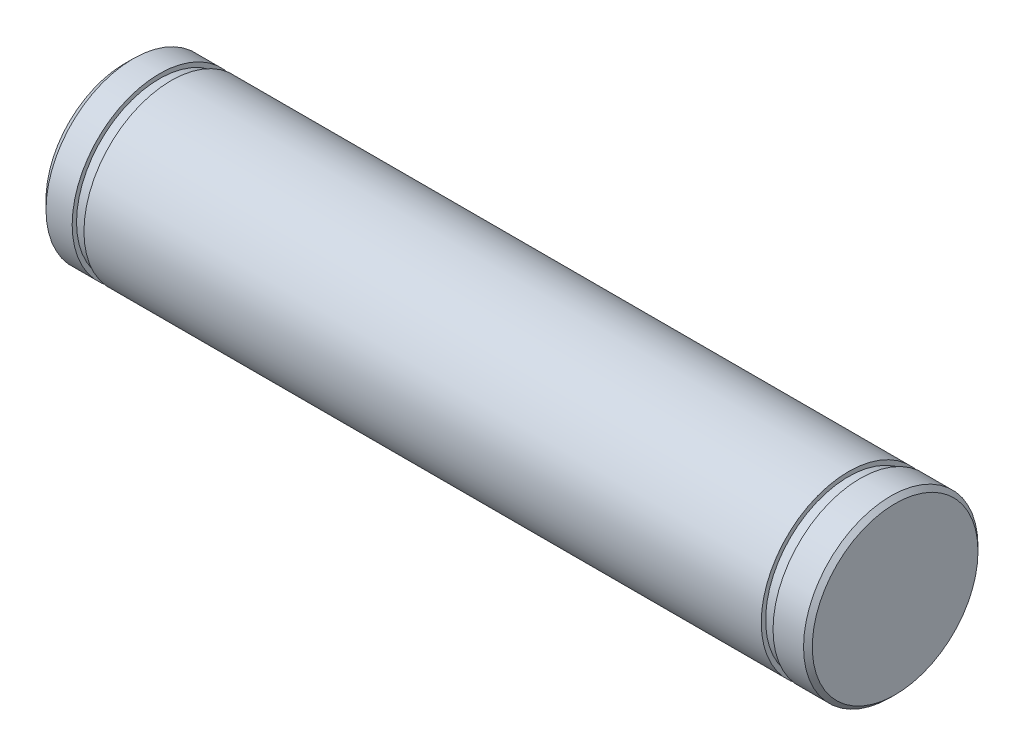
ISO-10303-21;
HEADER;
FILE_DESCRIPTION(('STEP AP214'),'2;1');
FILE_NAME('part.step','',(''),(''),'','','');
FILE_SCHEMA(('AUTOMOTIVE_DESIGN { 1 0 10303 214 1 1 1 1 }'));
ENDSEC;
DATA;
#1=APPLICATION_CONTEXT('core data for automotive mechanical design processes');
#2=APPLICATION_PROTOCOL_DEFINITION('international standard','automotive_design',2000,#1);
#3=PRODUCT_CONTEXT('',#1,'mechanical');
#4=PRODUCT('Part','Part','',(#3));
#5=PRODUCT_RELATED_PRODUCT_CATEGORY('part','',(#4));
#6=PRODUCT_DEFINITION_FORMATION('','',#4);
#7=PRODUCT_DEFINITION_CONTEXT('part definition',#1,'design');
#8=PRODUCT_DEFINITION('design','',#6,#7);
#9=PRODUCT_DEFINITION_SHAPE('','',#8);
#10=(LENGTH_UNIT() NAMED_UNIT(*) SI_UNIT(.MILLI.,.METRE.));
#11=(NAMED_UNIT(*) PLANE_ANGLE_UNIT() SI_UNIT($,.RADIAN.));
#12=(NAMED_UNIT(*) SI_UNIT($,.STERADIAN.) SOLID_ANGLE_UNIT());
#13=UNCERTAINTY_MEASURE_WITH_UNIT(LENGTH_MEASURE(1.E-05),#10,'distance_accuracy_value','');
#14=(GEOMETRIC_REPRESENTATION_CONTEXT(3) GLOBAL_UNCERTAINTY_ASSIGNED_CONTEXT((#13)) GLOBAL_UNIT_ASSIGNED_CONTEXT((#10,
#11,#12)) REPRESENTATION_CONTEXT('',''));
#15=CARTESIAN_POINT('',(0.,0.,0.));
#16=DIRECTION('',(0.,0.,1.));
#17=DIRECTION('',(1.,0.,0.));
#18=AXIS2_PLACEMENT_3D('',#15,#16,#17);
#19=CARTESIAN_POINT('',(44.175,0.,0.));
#20=DIRECTION('',(-1.,0.,0.));
#21=DIRECTION('',(0.,0.,1.));
#22=AXIS2_PLACEMENT_3D('',#19,#20,#21);
#23=CYLINDRICAL_SURFACE('',#22,10.);
#24=CARTESIAN_POINT('',(38.825,0.,0.));
#25=DIRECTION('',(1.,0.,0.));
#26=DIRECTION('',(0.,0.,-1.));
#27=AXIS2_PLACEMENT_3D('',#24,#25,#26);
#28=CIRCLE('',#27,10.);
#29=CARTESIAN_POINT('',(38.825,0.,-10.));
#30=VERTEX_POINT('',#29);
#31=EDGE_CURVE('E62',#30,#30,#28,.T.);
#32=ORIENTED_EDGE('',*,*,#31,.F.);
#33=EDGE_LOOP('',(#32));
#34=FACE_BOUND('',#33,.T.);
#35=CARTESIAN_POINT('',(-38.825,0.,0.));
#36=DIRECTION('',(1.,0.,0.));
#37=DIRECTION('',(0.,0.,-1.));
#38=AXIS2_PLACEMENT_3D('',#35,#36,#37);
#39=CIRCLE('',#38,10.);
#40=CARTESIAN_POINT('',(-38.825,0.,-10.));
#41=VERTEX_POINT('',#40);
#42=EDGE_CURVE('E72',#41,#41,#39,.T.);
#43=ORIENTED_EDGE('',*,*,#42,.T.);
#44=EDGE_LOOP('',(#43));
#45=FACE_BOUND('',#44,.T.);
#46=ADVANCED_FACE('F41',(#34,#45),#23,.T.);
#47=CARTESIAN_POINT('',(38.825,0.,0.));
#48=DIRECTION('',(1.,0.,0.));
#49=DIRECTION('',(0.,0.,-1.));
#50=AXIS2_PLACEMENT_3D('',#47,#48,#49);
#51=PLANE('',#50);
#52=CARTESIAN_POINT('',(38.825,0.,0.));
#53=DIRECTION('',(1.,0.,0.));
#54=DIRECTION('',(0.,0.,-1.));
#55=AXIS2_PLACEMENT_3D('',#52,#53,#54);
#56=CIRCLE('',#55,9.5);
#57=CARTESIAN_POINT('',(38.825,0.,-9.5));
#58=VERTEX_POINT('',#57);
#59=EDGE_CURVE('E66',#58,#58,#56,.T.);
#60=ORIENTED_EDGE('',*,*,#59,.F.);
#61=EDGE_LOOP('',(#60));
#62=FACE_BOUND('',#61,.T.);
#63=ORIENTED_EDGE('',*,*,#31,.T.);
#64=EDGE_LOOP('',(#63));
#65=FACE_BOUND('',#64,.T.);
#66=ADVANCED_FACE('F108',(#62,#65),#51,.T.);
#67=CARTESIAN_POINT('',(40.175,0.,0.));
#68=DIRECTION('',(1.,0.,0.));
#69=DIRECTION('',(0.,0.,-1.));
#70=AXIS2_PLACEMENT_3D('',#67,#68,#69);
#71=PLANE('',#70);
#72=CARTESIAN_POINT('',(40.175,0.,0.));
#73=DIRECTION('',(1.,0.,0.));
#74=DIRECTION('',(0.,0.,-1.));
#75=AXIS2_PLACEMENT_3D('',#72,#73,#74);
#76=CIRCLE('',#75,9.5);
#77=CARTESIAN_POINT('',(40.175,0.,-9.5));
#78=VERTEX_POINT('',#77);
#79=EDGE_CURVE('E69',#78,#78,#76,.T.);
#80=ORIENTED_EDGE('',*,*,#79,.T.);
#81=EDGE_LOOP('',(#80));
#82=FACE_BOUND('',#81,.T.);
#83=CARTESIAN_POINT('',(40.175,0.,0.));
#84=DIRECTION('',(1.,0.,0.));
#85=DIRECTION('',(0.,0.,-1.));
#86=AXIS2_PLACEMENT_3D('',#83,#84,#85);
#87=CIRCLE('',#86,10.);
#88=CARTESIAN_POINT('',(40.175,0.,-10.));
#89=VERTEX_POINT('',#88);
#90=EDGE_CURVE('E63',#89,#89,#87,.T.);
#91=ORIENTED_EDGE('',*,*,#90,.F.);
#92=EDGE_LOOP('',(#91));
#93=FACE_BOUND('',#92,.T.);
#94=ADVANCED_FACE('F117',(#82,#93),#71,.F.);
#95=CARTESIAN_POINT('',(38.825,0.,0.));
#96=DIRECTION('',(1.,0.,0.));
#97=DIRECTION('',(0.,0.,-1.));
#98=AXIS2_PLACEMENT_3D('',#95,#96,#97);
#99=CYLINDRICAL_SURFACE('',#98,9.5);
#100=CARTESIAN_POINT('',(38.825,0.,-9.5));
#101=CARTESIAN_POINT('',(38.8390625,0.,-9.5));
#102=CARTESIAN_POINT('',(38.853125,0.,-9.5));
#103=CARTESIAN_POINT('',(38.88125,0.,-9.5));
#104=CARTESIAN_POINT('',(38.8953125,0.,-9.5));
#105=CARTESIAN_POINT('',(38.9234375,0.,-9.5));
#106=CARTESIAN_POINT('',(38.9375,0.,-9.5));
#107=CARTESIAN_POINT('',(38.965625,0.,-9.5));
#108=CARTESIAN_POINT('',(38.9796875,0.,-9.5));
#109=CARTESIAN_POINT('',(39.0078125,0.,-9.5));
#110=CARTESIAN_POINT('',(39.021875,0.,-9.5));
#111=CARTESIAN_POINT('',(39.05,0.,-9.5));
#112=CARTESIAN_POINT('',(39.0640625,0.,-9.5));
#113=CARTESIAN_POINT('',(39.0921875,0.,-9.5));
#114=CARTESIAN_POINT('',(39.10625,0.,-9.5));
#115=CARTESIAN_POINT('',(39.134375,0.,-9.5));
#116=CARTESIAN_POINT('',(39.1484375,0.,-9.5));
#117=CARTESIAN_POINT('',(39.1765625,0.,-9.5));
#118=CARTESIAN_POINT('',(39.190625,0.,-9.5));
#119=CARTESIAN_POINT('',(39.21875,0.,-9.5));
#120=CARTESIAN_POINT('',(39.2328125,0.,-9.5));
#121=CARTESIAN_POINT('',(39.2609375,0.,-9.5));
#122=CARTESIAN_POINT('',(39.275,0.,-9.5));
#123=CARTESIAN_POINT('',(39.303125,0.,-9.5));
#124=CARTESIAN_POINT('',(39.3171875,0.,-9.5));
#125=CARTESIAN_POINT('',(39.3453125,0.,-9.5));
#126=CARTESIAN_POINT('',(39.359375,0.,-9.5));
#127=CARTESIAN_POINT('',(39.3875,0.,-9.5));
#128=CARTESIAN_POINT('',(39.4015625,0.,-9.5));
#129=CARTESIAN_POINT('',(39.4296875,0.,-9.5));
#130=CARTESIAN_POINT('',(39.44375,0.,-9.5));
#131=CARTESIAN_POINT('',(39.471875,0.,-9.5));
#132=CARTESIAN_POINT('',(39.4859375,0.,-9.5));
#133=CARTESIAN_POINT('',(39.5140625,0.,-9.5));
#134=CARTESIAN_POINT('',(39.528125,0.,-9.5));
#135=CARTESIAN_POINT('',(39.55625,0.,-9.5));
#136=CARTESIAN_POINT('',(39.5703125,0.,-9.5));
#137=CARTESIAN_POINT('',(39.5984375,0.,-9.5));
#138=CARTESIAN_POINT('',(39.6125,0.,-9.5));
#139=CARTESIAN_POINT('',(39.640625,0.,-9.5));
#140=CARTESIAN_POINT('',(39.6546875,0.,-9.5));
#141=CARTESIAN_POINT('',(39.6828125,0.,-9.5));
#142=CARTESIAN_POINT('',(39.696875,0.,-9.5));
#143=CARTESIAN_POINT('',(39.725,0.,-9.5));
#144=CARTESIAN_POINT('',(39.7390625,0.,-9.5));
#145=CARTESIAN_POINT('',(39.7671875,0.,-9.5));
#146=CARTESIAN_POINT('',(39.78125,0.,-9.5));
#147=CARTESIAN_POINT('',(39.809375,0.,-9.5));
#148=CARTESIAN_POINT('',(39.8234375,0.,-9.5));
#149=CARTESIAN_POINT('',(39.8515625,0.,-9.5));
#150=CARTESIAN_POINT('',(39.865625,0.,-9.5));
#151=CARTESIAN_POINT('',(39.89375,0.,-9.5));
#152=CARTESIAN_POINT('',(39.9078125,0.,-9.5));
#153=CARTESIAN_POINT('',(39.9359375,0.,-9.5));
#154=CARTESIAN_POINT('',(39.95,0.,-9.5));
#155=CARTESIAN_POINT('',(39.978125,0.,-9.5));
#156=CARTESIAN_POINT('',(39.9921875,0.,-9.5));
#157=CARTESIAN_POINT('',(40.0203125,0.,-9.5));
#158=CARTESIAN_POINT('',(40.034375,0.,-9.5));
#159=CARTESIAN_POINT('',(40.0625,0.,-9.5));
#160=CARTESIAN_POINT('',(40.0765625,0.,-9.5));
#161=CARTESIAN_POINT('',(40.1046875,0.,-9.5));
#162=CARTESIAN_POINT('',(40.11875,0.,-9.5));
#163=CARTESIAN_POINT('',(40.146875,0.,-9.5));
#164=CARTESIAN_POINT('',(40.1609375,0.,-9.5));
#165=CARTESIAN_POINT('',(40.175,0.,-9.5));
#166=B_SPLINE_CURVE_WITH_KNOTS('',3,(#100,#101,#102,#103,#104,#105,#106,#107,#108,#109,#110,
#111,#112,#113,#114,#115,#116,#117,#118,#119,#120,#121,#122,#123,#124,#125,#126,#127,#128,#129,
#130,#131,#132,#133,#134,#135,#136,#137,#138,#139,#140,#141,#142,#143,#144,#145,#146,#147,#148,
#149,#150,#151,#152,#153,#154,#155,#156,#157,#158,#159,#160,#161,#162,#163,#164,#165),
.UNSPECIFIED.,.F.,.F.,(4,2,2,2,2,2,2,2,2,2,2,2,2,2,2,2,2,2,2,2,2,2,2,2,2,2,2,2,2,2,2,2,4),(0.,
0.0421875000000058,0.0843750000000046,0.126562500000003,0.168750000000002,0.210937500000001,
0.253125,0.295312500000006,0.337500000000004,0.379687500000003,0.421875000000002,
0.464062500000001,0.50625,0.548437500000005,0.590625000000004,0.632812500000003,
0.675000000000002,0.717187500000001,0.759375,0.801562499999998,0.843750000000004,
0.885937500000003,0.928125000000002,0.970312500000001,1.0125,1.0546875,1.096875,1.1390625,
1.18125,1.2234375,1.265625,1.3078125,1.35),.UNSPECIFIED.);
#167=EDGE_CURVE('BSEAM133',#58,#78,#166,.T.);
#168=ORIENTED_EDGE('',*,*,#59,.T.);
#169=ORIENTED_EDGE('',*,*,#79,.F.);
#170=ORIENTED_EDGE('',*,*,#167,.T.);
#171=ORIENTED_EDGE('',*,*,#167,.F.);
#172=EDGE_LOOP('',(#168,#170,#169,#171));
#173=FACE_BOUND('',#172,.T.);
#174=ADVANCED_FACE('F133',(#173),#99,.T.);
#175=CARTESIAN_POINT('',(44.175,0.,0.));
#176=DIRECTION('',(1.,0.,0.));
#177=DIRECTION('',(0.,0.,-1.));
#178=AXIS2_PLACEMENT_3D('',#175,#176,#177);
#179=PLANE('',#178);
#180=CARTESIAN_POINT('',(44.175,0.,0.));
#181=DIRECTION('',(1.,0.,0.));
#182=DIRECTION('',(0.,0.,-1.));
#183=AXIS2_PLACEMENT_3D('',#180,#181,#182);
#184=CIRCLE('',#183,9.50000000000002);
#185=CARTESIAN_POINT('',(44.175,0.,-9.50000000000002));
#186=VERTEX_POINT('',#185);
#187=EDGE_CURVE('E57',#186,#186,#184,.T.);
#188=ORIENTED_EDGE('',*,*,#187,.T.);
#189=EDGE_LOOP('',(#188));
#190=FACE_BOUND('',#189,.T.);
#191=ADVANCED_FACE('F126',(#190),#179,.T.);
#192=CARTESIAN_POINT('',(43.675,0.,0.));
#193=DIRECTION('',(1.,0.,0.));
#194=DIRECTION('',(0.,0.,-1.));
#195=AXIS2_PLACEMENT_3D('',#192,#193,#194);
#196=CIRCLE('',#195,10.);
#197=CARTESIAN_POINT('',(43.675,0.,-10.));
#198=VERTEX_POINT('',#197);
#199=EDGE_CURVE('E53',#198,#198,#196,.F.);
#200=ORIENTED_EDGE('',*,*,#199,.T.);
#201=EDGE_LOOP('',(#200));
#202=FACE_BOUND('',#201,.T.);
#203=ORIENTED_EDGE('',*,*,#90,.T.);
#204=EDGE_LOOP('',(#203));
#205=FACE_BOUND('',#204,.T.);
#206=ADVANCED_FACE('F112',(#202,#205),#23,.T.);
#207=CARTESIAN_POINT('',(44.175,0.,0.));
#208=DIRECTION('',(-1.,0.,0.));
#209=DIRECTION('',(0.,0.,1.));
#210=AXIS2_PLACEMENT_3D('',#207,#208,#209);
#211=CONICAL_SURFACE('',#210,9.50000000000002,0.785398163397426);
#212=ORIENTED_EDGE('',*,*,#199,.F.);
#213=EDGE_LOOP('',(#212));
#214=FACE_BOUND('',#213,.T.);
#215=ORIENTED_EDGE('',*,*,#187,.F.);
#216=EDGE_LOOP('',(#215));
#217=FACE_BOUND('',#216,.T.);
#218=ADVANCED_FACE('F103',(#214,#217),#211,.T.);
#219=CARTESIAN_POINT('',(-38.825,0.,0.));
#220=DIRECTION('',(-1.,0.,0.));
#221=DIRECTION('',(0.,0.,-1.));
#222=AXIS2_PLACEMENT_3D('',#219,#220,#221);
#223=PLANE('',#222);
#224=ORIENTED_EDGE('',*,*,#42,.F.);
#225=EDGE_LOOP('',(#224));
#226=FACE_BOUND('',#225,.T.);
#227=CARTESIAN_POINT('',(-38.825,0.,0.));
#228=DIRECTION('',(1.,0.,0.));
#229=DIRECTION('',(0.,0.,-1.));
#230=AXIS2_PLACEMENT_3D('',#227,#228,#229);
#231=CIRCLE('',#230,9.5);
#232=CARTESIAN_POINT('',(-38.825,0.,9.5));
#233=VERTEX_POINT('',#232);
#234=EDGE_CURVE('E78',#233,#233,#231,.T.);
#235=ORIENTED_EDGE('',*,*,#234,.T.);
#236=EDGE_LOOP('',(#235));
#237=FACE_BOUND('',#236,.T.);
#238=ADVANCED_FACE('F87',(#226,#237),#223,.T.);
#239=CARTESIAN_POINT('',(-40.175,0.,0.));
#240=DIRECTION('',(-1.,0.,0.));
#241=DIRECTION('',(0.,0.,-1.));
#242=AXIS2_PLACEMENT_3D('',#239,#240,#241);
#243=PLANE('',#242);
#244=CARTESIAN_POINT('',(-40.175,0.,0.));
#245=DIRECTION('',(1.,0.,0.));
#246=DIRECTION('',(0.,0.,-1.));
#247=AXIS2_PLACEMENT_3D('',#244,#245,#246);
#248=CIRCLE('',#247,10.);
#249=CARTESIAN_POINT('',(-40.175,0.,-10.));
#250=VERTEX_POINT('',#249);
#251=EDGE_CURVE('E75',#250,#250,#248,.T.);
#252=ORIENTED_EDGE('',*,*,#251,.T.);
#253=EDGE_LOOP('',(#252));
#254=FACE_BOUND('',#253,.T.);
#255=CARTESIAN_POINT('',(-40.175,0.,0.));
#256=DIRECTION('',(1.,0.,0.));
#257=DIRECTION('',(0.,0.,-1.));
#258=AXIS2_PLACEMENT_3D('',#255,#256,#257);
#259=CIRCLE('',#258,9.5);
#260=CARTESIAN_POINT('',(-40.175,0.,9.5));
#261=VERTEX_POINT('',#260);
#262=EDGE_CURVE('E81',#261,#261,#259,.T.);
#263=ORIENTED_EDGE('',*,*,#262,.F.);
#264=EDGE_LOOP('',(#263));
#265=FACE_BOUND('',#264,.T.);
#266=ADVANCED_FACE('F93',(#254,#265),#243,.F.);
#267=CARTESIAN_POINT('',(-38.825,0.,0.));
#268=DIRECTION('',(-1.,0.,0.));
#269=DIRECTION('',(0.,0.,1.));
#270=AXIS2_PLACEMENT_3D('',#267,#268,#269);
#271=CYLINDRICAL_SURFACE('',#270,9.5);
#272=CARTESIAN_POINT('',(-38.825,0.,9.5));
#273=CARTESIAN_POINT('',(-38.8390625,0.,9.5));
#274=CARTESIAN_POINT('',(-38.853125,0.,9.5));
#275=CARTESIAN_POINT('',(-38.88125,0.,9.5));
#276=CARTESIAN_POINT('',(-38.8953125,0.,9.5));
#277=CARTESIAN_POINT('',(-38.9234375,0.,9.5));
#278=CARTESIAN_POINT('',(-38.9375,0.,9.5));
#279=CARTESIAN_POINT('',(-38.965625,0.,9.5));
#280=CARTESIAN_POINT('',(-38.9796875,0.,9.5));
#281=CARTESIAN_POINT('',(-39.0078125,0.,9.5));
#282=CARTESIAN_POINT('',(-39.021875,0.,9.5));
#283=CARTESIAN_POINT('',(-39.05,0.,9.5));
#284=CARTESIAN_POINT('',(-39.0640625,0.,9.5));
#285=CARTESIAN_POINT('',(-39.0921875,0.,9.5));
#286=CARTESIAN_POINT('',(-39.10625,0.,9.5));
#287=CARTESIAN_POINT('',(-39.134375,0.,9.5));
#288=CARTESIAN_POINT('',(-39.1484375,0.,9.5));
#289=CARTESIAN_POINT('',(-39.1765625,0.,9.5));
#290=CARTESIAN_POINT('',(-39.190625,0.,9.5));
#291=CARTESIAN_POINT('',(-39.21875,0.,9.5));
#292=CARTESIAN_POINT('',(-39.2328125,0.,9.5));
#293=CARTESIAN_POINT('',(-39.2609375,0.,9.5));
#294=CARTESIAN_POINT('',(-39.275,0.,9.5));
#295=CARTESIAN_POINT('',(-39.303125,0.,9.5));
#296=CARTESIAN_POINT('',(-39.3171875,0.,9.5));
#297=CARTESIAN_POINT('',(-39.3453125,0.,9.5));
#298=CARTESIAN_POINT('',(-39.359375,0.,9.5));
#299=CARTESIAN_POINT('',(-39.3875,0.,9.5));
#300=CARTESIAN_POINT('',(-39.4015625,0.,9.5));
#301=CARTESIAN_POINT('',(-39.4296875,0.,9.5));
#302=CARTESIAN_POINT('',(-39.44375,0.,9.5));
#303=CARTESIAN_POINT('',(-39.471875,0.,9.5));
#304=CARTESIAN_POINT('',(-39.4859375,0.,9.5));
#305=CARTESIAN_POINT('',(-39.5140625,0.,9.5));
#306=CARTESIAN_POINT('',(-39.528125,0.,9.5));
#307=CARTESIAN_POINT('',(-39.55625,0.,9.5));
#308=CARTESIAN_POINT('',(-39.5703125,0.,9.5));
#309=CARTESIAN_POINT('',(-39.5984375,0.,9.5));
#310=CARTESIAN_POINT('',(-39.6125,0.,9.5));
#311=CARTESIAN_POINT('',(-39.640625,0.,9.5));
#312=CARTESIAN_POINT('',(-39.6546875,0.,9.5));
#313=CARTESIAN_POINT('',(-39.6828125,0.,9.5));
#314=CARTESIAN_POINT('',(-39.696875,0.,9.5));
#315=CARTESIAN_POINT('',(-39.725,0.,9.5));
#316=CARTESIAN_POINT('',(-39.7390625,0.,9.5));
#317=CARTESIAN_POINT('',(-39.7671875,0.,9.5));
#318=CARTESIAN_POINT('',(-39.78125,0.,9.5));
#319=CARTESIAN_POINT('',(-39.809375,0.,9.5));
#320=CARTESIAN_POINT('',(-39.8234375,0.,9.5));
#321=CARTESIAN_POINT('',(-39.8515625,0.,9.5));
#322=CARTESIAN_POINT('',(-39.865625,0.,9.5));
#323=CARTESIAN_POINT('',(-39.89375,0.,9.5));
#324=CARTESIAN_POINT('',(-39.9078125,0.,9.5));
#325=CARTESIAN_POINT('',(-39.9359375,0.,9.5));
#326=CARTESIAN_POINT('',(-39.95,0.,9.5));
#327=CARTESIAN_POINT('',(-39.978125,0.,9.5));
#328=CARTESIAN_POINT('',(-39.9921875,0.,9.5));
#329=CARTESIAN_POINT('',(-40.0203125,0.,9.5));
#330=CARTESIAN_POINT('',(-40.034375,0.,9.5));
#331=CARTESIAN_POINT('',(-40.0625,0.,9.5));
#332=CARTESIAN_POINT('',(-40.0765625,0.,9.5));
#333=CARTESIAN_POINT('',(-40.1046875,0.,9.5));
#334=CARTESIAN_POINT('',(-40.11875,0.,9.5));
#335=CARTESIAN_POINT('',(-40.146875,0.,9.5));
#336=CARTESIAN_POINT('',(-40.1609375,0.,9.5));
#337=CARTESIAN_POINT('',(-40.175,0.,9.5));
#338=B_SPLINE_CURVE_WITH_KNOTS('',3,(#272,#273,#274,#275,#276,#277,#278,#279,#280,#281,#282,
#283,#284,#285,#286,#287,#288,#289,#290,#291,#292,#293,#294,#295,#296,#297,#298,#299,#300,#301,
#302,#303,#304,#305,#306,#307,#308,#309,#310,#311,#312,#313,#314,#315,#316,#317,#318,#319,#320,
#321,#322,#323,#324,#325,#326,#327,#328,#329,#330,#331,#332,#333,#334,#335,#336,#337),
.UNSPECIFIED.,.F.,.F.,(4,2,2,2,2,2,2,2,2,2,2,2,2,2,2,2,2,2,2,2,2,2,2,2,2,2,2,2,2,2,2,2,4),(0.,
0.0421875000000058,0.0843750000000046,0.126562500000003,0.168750000000002,0.210937500000001,
0.253125,0.295312500000006,0.337500000000004,0.379687500000003,0.421875000000002,
0.464062500000001,0.50625,0.548437500000005,0.590625000000004,0.632812500000003,
0.675000000000002,0.717187500000001,0.759375,0.801562499999998,0.843750000000004,
0.885937500000003,0.928125000000002,0.970312500000001,1.0125,1.0546875,1.096875,1.1390625,
1.18125,1.2234375,1.265625,1.3078125,1.35),.UNSPECIFIED.);
#339=EDGE_CURVE('BSEAM89',#233,#261,#338,.T.);
#340=ORIENTED_EDGE('',*,*,#234,.F.);
#341=ORIENTED_EDGE('',*,*,#262,.T.);
#342=ORIENTED_EDGE('',*,*,#339,.T.);
#343=ORIENTED_EDGE('',*,*,#339,.F.);
#344=EDGE_LOOP('',(#340,#342,#341,#343));
#345=FACE_BOUND('',#344,.T.);
#346=ADVANCED_FACE('F89',(#345),#271,.T.);
#347=CARTESIAN_POINT('',(-44.175,0.,0.));
#348=DIRECTION('',(1.,0.,0.));
#349=DIRECTION('',(0.,0.,-1.));
#350=AXIS2_PLACEMENT_3D('',#347,#348,#349);
#351=PLANE('',#350);
#352=CARTESIAN_POINT('',(-44.175,0.,0.));
#353=DIRECTION('',(1.,0.,0.));
#354=DIRECTION('',(0.,0.,-1.));
#355=AXIS2_PLACEMENT_3D('',#352,#353,#354);
#356=CIRCLE('',#355,8.99999999999997);
#357=CARTESIAN_POINT('',(-44.175,0.,-8.99999999999997));
#358=VERTEX_POINT('',#357);
#359=EDGE_CURVE('E10',#358,#358,#356,.F.);
#360=ORIENTED_EDGE('',*,*,#359,.T.);
#361=EDGE_LOOP('',(#360));
#362=FACE_BOUND('',#361,.T.);
#363=ADVANCED_FACE('F92',(#362),#351,.F.);
#364=CARTESIAN_POINT('',(-43.175,0.,0.));
#365=DIRECTION('',(1.,0.,0.));
#366=DIRECTION('',(0.,0.,-1.));
#367=AXIS2_PLACEMENT_3D('',#364,#365,#366);
#368=CONICAL_SURFACE('',#367,10.,0.785398163397454);
#369=ORIENTED_EDGE('',*,*,#359,.F.);
#370=EDGE_LOOP('',(#369));
#371=FACE_BOUND('',#370,.T.);
#372=CARTESIAN_POINT('',(-43.175,0.,0.));
#373=DIRECTION('',(1.,0.,0.));
#374=DIRECTION('',(0.,0.,-1.));
#375=AXIS2_PLACEMENT_3D('',#372,#373,#374);
#376=CIRCLE('',#375,10.);
#377=CARTESIAN_POINT('',(-43.175,0.,-10.));
#378=VERTEX_POINT('',#377);
#379=EDGE_CURVE('E49',#378,#378,#376,.T.);
#380=ORIENTED_EDGE('',*,*,#379,.F.);
#381=EDGE_LOOP('',(#380));
#382=FACE_BOUND('',#381,.T.);
#383=ADVANCED_FACE('F44',(#371,#382),#368,.T.);
#384=ORIENTED_EDGE('',*,*,#251,.F.);
#385=EDGE_LOOP('',(#384));
#386=FACE_BOUND('',#385,.T.);
#387=ORIENTED_EDGE('',*,*,#379,.T.);
#388=EDGE_LOOP('',(#387));
#389=FACE_BOUND('',#388,.T.);
#390=ADVANCED_FACE('F111',(#386,#389),#23,.T.);
#391=CLOSED_SHELL('',(#46,#66,#94,#174,#191,#206,#218,#238,#266,#346,#363,#383,#390));
#392=MANIFOLD_SOLID_BREP('B2',#391);
#393=ADVANCED_BREP_SHAPE_REPRESENTATION('',(#18,#392),#14);
#394=SHAPE_DEFINITION_REPRESENTATION(#9,#393);
ENDSEC;
END-ISO-10303-21;
